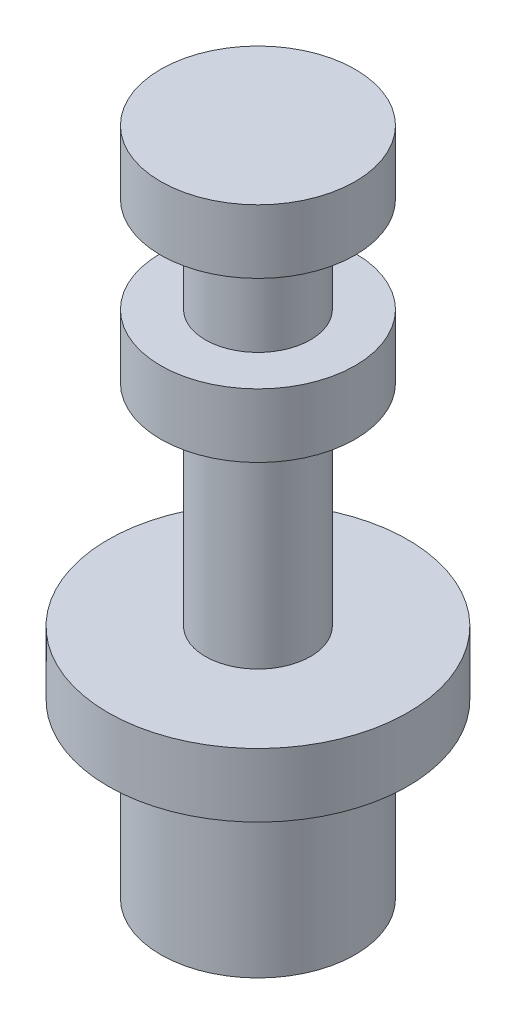
ISO-10303-21;
HEADER;
FILE_DESCRIPTION(('STEP AP214'),'2;1');
FILE_NAME('part.step','',(''),(''),'','','');
FILE_SCHEMA(('AUTOMOTIVE_DESIGN { 1 0 10303 214 1 1 1 1 }'));
ENDSEC;
DATA;
#1=APPLICATION_CONTEXT('core data for automotive mechanical design processes');
#2=APPLICATION_PROTOCOL_DEFINITION('international standard','automotive_design',2000,#1);
#3=PRODUCT_CONTEXT('',#1,'mechanical');
#4=PRODUCT('Part','Part','',(#3));
#5=PRODUCT_RELATED_PRODUCT_CATEGORY('part','',(#4));
#6=PRODUCT_DEFINITION_FORMATION('','',#4);
#7=PRODUCT_DEFINITION_CONTEXT('part definition',#1,'design');
#8=PRODUCT_DEFINITION('design','',#6,#7);
#9=PRODUCT_DEFINITION_SHAPE('','',#8);
#10=(LENGTH_UNIT() NAMED_UNIT(*) SI_UNIT(.MILLI.,.METRE.));
#11=(NAMED_UNIT(*) PLANE_ANGLE_UNIT() SI_UNIT($,.RADIAN.));
#12=(NAMED_UNIT(*) SI_UNIT($,.STERADIAN.) SOLID_ANGLE_UNIT());
#13=UNCERTAINTY_MEASURE_WITH_UNIT(LENGTH_MEASURE(1.E-05),#10,'distance_accuracy_value','');
#14=(GEOMETRIC_REPRESENTATION_CONTEXT(3) GLOBAL_UNCERTAINTY_ASSIGNED_CONTEXT((#13)) GLOBAL_UNIT_ASSIGNED_CONTEXT((#10,
#11,#12)) REPRESENTATION_CONTEXT('',''));
#15=CARTESIAN_POINT('',(0.,0.,0.));
#16=DIRECTION('',(0.,0.,1.));
#17=DIRECTION('',(1.,0.,0.));
#18=AXIS2_PLACEMENT_3D('',#15,#16,#17);
#19=CARTESIAN_POINT('',(0.,1.3716,0.));
#20=DIRECTION('',(0.,-1.,0.));
#21=DIRECTION('',(0.,0.,-1.));
#22=AXIS2_PLACEMENT_3D('',#19,#20,#21);
#23=CYLINDRICAL_SURFACE('',#22,0.7747);
#24=CARTESIAN_POINT('',(0.,1.3716,0.));
#25=DIRECTION('',(0.,1.,0.));
#26=DIRECTION('',(0.,0.,1.));
#27=AXIS2_PLACEMENT_3D('',#24,#25,#26);
#28=CIRCLE('',#27,0.7747);
#29=CARTESIAN_POINT('',(0.,1.3716,0.7747));
#30=VERTEX_POINT('',#29);
#31=EDGE_CURVE('E51',#30,#30,#28,.T.);
#32=ORIENTED_EDGE('',*,*,#31,.F.);
#33=EDGE_LOOP('',(#32));
#34=FACE_BOUND('',#33,.T.);
#35=CARTESIAN_POINT('',(0.,0.,0.));
#36=DIRECTION('',(0.,1.,0.));
#37=DIRECTION('',(0.,0.,1.));
#38=AXIS2_PLACEMENT_3D('',#35,#36,#37);
#39=CIRCLE('',#38,0.7747);
#40=CARTESIAN_POINT('',(0.,0.,0.7747));
#41=VERTEX_POINT('',#40);
#42=EDGE_CURVE('E42',#41,#41,#39,.T.);
#43=ORIENTED_EDGE('',*,*,#42,.T.);
#44=EDGE_LOOP('',(#43));
#45=FACE_BOUND('',#44,.T.);
#46=ADVANCED_FACE('F39',(#34,#45),#23,.T.);
#47=CARTESIAN_POINT('',(0.,0.,0.));
#48=DIRECTION('',(0.,1.,0.));
#49=DIRECTION('',(0.,0.,1.));
#50=AXIS2_PLACEMENT_3D('',#47,#48,#49);
#51=PLANE('',#50);
#52=ORIENTED_EDGE('',*,*,#42,.F.);
#53=EDGE_LOOP('',(#52));
#54=FACE_BOUND('',#53,.T.);
#55=ADVANCED_FACE('F78',(#54),#51,.F.);
#56=CARTESIAN_POINT('',(0.,1.8796,0.));
#57=DIRECTION('',(0.,-1.,0.));
#58=DIRECTION('',(0.,0.,-1.));
#59=AXIS2_PLACEMENT_3D('',#56,#57,#58);
#60=CYLINDRICAL_SURFACE('',#59,1.1938);
#61=CARTESIAN_POINT('',(0.,1.8796,0.));
#62=DIRECTION('',(0.,1.,0.));
#63=DIRECTION('',(0.,0.,1.));
#64=AXIS2_PLACEMENT_3D('',#61,#62,#63);
#65=CIRCLE('',#64,1.1938);
#66=CARTESIAN_POINT('',(0.,1.8796,1.1938));
#67=VERTEX_POINT('',#66);
#68=EDGE_CURVE('E67',#67,#67,#65,.T.);
#69=ORIENTED_EDGE('',*,*,#68,.F.);
#70=EDGE_LOOP('',(#69));
#71=FACE_BOUND('',#70,.T.);
#72=CARTESIAN_POINT('',(0.,1.3716,0.));
#73=DIRECTION('',(0.,1.,0.));
#74=DIRECTION('',(0.,0.,1.));
#75=AXIS2_PLACEMENT_3D('',#72,#73,#74);
#76=CIRCLE('',#75,1.1938);
#77=CARTESIAN_POINT('',(0.,1.3716,1.1938));
#78=VERTEX_POINT('',#77);
#79=EDGE_CURVE('E65',#78,#78,#76,.T.);
#80=ORIENTED_EDGE('',*,*,#79,.T.);
#81=EDGE_LOOP('',(#80));
#82=FACE_BOUND('',#81,.T.);
#83=ADVANCED_FACE('F80',(#71,#82),#60,.T.);
#84=CARTESIAN_POINT('',(0.,1.8796,0.));
#85=DIRECTION('',(0.,1.,0.));
#86=DIRECTION('',(0.,0.,1.));
#87=AXIS2_PLACEMENT_3D('',#84,#85,#86);
#88=PLANE('',#87);
#89=CARTESIAN_POINT('',(0.,1.8796,0.));
#90=DIRECTION('',(0.,1.,0.));
#91=DIRECTION('',(0.,0.,1.));
#92=AXIS2_PLACEMENT_3D('',#89,#90,#91);
#93=CIRCLE('',#92,0.4191);
#94=CARTESIAN_POINT('',(0.,1.8796,0.4191));
#95=VERTEX_POINT('',#94);
#96=EDGE_CURVE('E46',#95,#95,#93,.T.);
#97=ORIENTED_EDGE('',*,*,#96,.F.);
#98=EDGE_LOOP('',(#97));
#99=FACE_BOUND('',#98,.T.);
#100=ORIENTED_EDGE('',*,*,#68,.T.);
#101=EDGE_LOOP('',(#100));
#102=FACE_BOUND('',#101,.T.);
#103=ADVANCED_FACE('F85',(#99,#102),#88,.T.);
#104=CARTESIAN_POINT('',(0.,1.3716,0.));
#105=DIRECTION('',(0.,1.,0.));
#106=DIRECTION('',(0.,0.,1.));
#107=AXIS2_PLACEMENT_3D('',#104,#105,#106);
#108=PLANE('',#107);
#109=ORIENTED_EDGE('',*,*,#31,.T.);
#110=EDGE_LOOP('',(#109));
#111=FACE_BOUND('',#110,.T.);
#112=ORIENTED_EDGE('',*,*,#79,.F.);
#113=EDGE_LOOP('',(#112));
#114=FACE_BOUND('',#113,.T.);
#115=ADVANCED_FACE('F90',(#111,#114),#108,.F.);
#116=CARTESIAN_POINT('',(0.,3.556,0.));
#117=DIRECTION('',(0.,-1.,0.));
#118=DIRECTION('',(0.,0.,-1.));
#119=AXIS2_PLACEMENT_3D('',#116,#117,#118);
#120=CYLINDRICAL_SURFACE('',#119,0.4191);
#121=CARTESIAN_POINT('',(0.,3.556,0.));
#122=DIRECTION('',(0.,1.,0.));
#123=DIRECTION('',(0.,0.,1.));
#124=AXIS2_PLACEMENT_3D('',#121,#122,#123);
#125=CIRCLE('',#124,0.4191);
#126=CARTESIAN_POINT('',(0.,3.556,0.4191));
#127=VERTEX_POINT('',#126);
#128=EDGE_CURVE('E60',#127,#127,#125,.T.);
#129=ORIENTED_EDGE('',*,*,#128,.F.);
#130=EDGE_LOOP('',(#129));
#131=FACE_BOUND('',#130,.T.);
#132=ORIENTED_EDGE('',*,*,#96,.T.);
#133=EDGE_LOOP('',(#132));
#134=FACE_BOUND('',#133,.T.);
#135=ADVANCED_FACE('F93',(#131,#134),#120,.T.);
#136=CARTESIAN_POINT('',(0.,4.064,0.));
#137=DIRECTION('',(0.,-1.,0.));
#138=DIRECTION('',(0.,0.,-1.));
#139=AXIS2_PLACEMENT_3D('',#136,#137,#138);
#140=CYLINDRICAL_SURFACE('',#139,0.7747);
#141=CARTESIAN_POINT('',(0.,4.064,0.));
#142=DIRECTION('',(0.,1.,0.));
#143=DIRECTION('',(0.,0.,1.));
#144=AXIS2_PLACEMENT_3D('',#141,#142,#143);
#145=CIRCLE('',#144,0.7747);
#146=CARTESIAN_POINT('',(0.,4.064,0.7747));
#147=VERTEX_POINT('',#146);
#148=EDGE_CURVE('E57',#147,#147,#145,.T.);
#149=ORIENTED_EDGE('',*,*,#148,.F.);
#150=EDGE_LOOP('',(#149));
#151=FACE_BOUND('',#150,.T.);
#152=CARTESIAN_POINT('',(0.,3.556,0.));
#153=DIRECTION('',(0.,1.,0.));
#154=DIRECTION('',(0.,0.,1.));
#155=AXIS2_PLACEMENT_3D('',#152,#153,#154);
#156=CIRCLE('',#155,0.7747);
#157=CARTESIAN_POINT('',(0.,3.556,0.7747));
#158=VERTEX_POINT('',#157);
#159=EDGE_CURVE('E61',#158,#158,#156,.T.);
#160=ORIENTED_EDGE('',*,*,#159,.T.);
#161=EDGE_LOOP('',(#160));
#162=FACE_BOUND('',#161,.T.);
#163=ADVANCED_FACE('F99',(#151,#162),#140,.T.);
#164=CARTESIAN_POINT('',(0.,4.064,0.));
#165=DIRECTION('',(0.,1.,0.));
#166=DIRECTION('',(0.,0.,1.));
#167=AXIS2_PLACEMENT_3D('',#164,#165,#166);
#168=PLANE('',#167);
#169=CARTESIAN_POINT('',(0.,4.064,0.));
#170=DIRECTION('',(0.,1.,0.));
#171=DIRECTION('',(0.,0.,1.));
#172=AXIS2_PLACEMENT_3D('',#169,#170,#171);
#173=CIRCLE('',#172,0.4191);
#174=CARTESIAN_POINT('',(0.,4.064,0.4191));
#175=VERTEX_POINT('',#174);
#176=EDGE_CURVE('E10',#175,#175,#173,.T.);
#177=ORIENTED_EDGE('',*,*,#176,.F.);
#178=EDGE_LOOP('',(#177));
#179=FACE_BOUND('',#178,.T.);
#180=ORIENTED_EDGE('',*,*,#148,.T.);
#181=EDGE_LOOP('',(#180));
#182=FACE_BOUND('',#181,.T.);
#183=ADVANCED_FACE('F103',(#179,#182),#168,.T.);
#184=CARTESIAN_POINT('',(0.,3.556,0.));
#185=DIRECTION('',(0.,1.,0.));
#186=DIRECTION('',(0.,0.,1.));
#187=AXIS2_PLACEMENT_3D('',#184,#185,#186);
#188=PLANE('',#187);
#189=ORIENTED_EDGE('',*,*,#128,.T.);
#190=EDGE_LOOP('',(#189));
#191=FACE_BOUND('',#190,.T.);
#192=ORIENTED_EDGE('',*,*,#159,.F.);
#193=EDGE_LOOP('',(#192));
#194=FACE_BOUND('',#193,.T.);
#195=ADVANCED_FACE('F105',(#191,#194),#188,.F.);
#196=CARTESIAN_POINT('',(0.,4.826,0.));
#197=DIRECTION('',(0.,-1.,0.));
#198=DIRECTION('',(0.,0.,-1.));
#199=AXIS2_PLACEMENT_3D('',#196,#197,#198);
#200=CYLINDRICAL_SURFACE('',#199,0.4191);
#201=CARTESIAN_POINT('',(0.,4.826,0.));
#202=DIRECTION('',(0.,1.,0.));
#203=DIRECTION('',(0.,0.,1.));
#204=AXIS2_PLACEMENT_3D('',#201,#202,#203);
#205=CIRCLE('',#204,0.4191);
#206=CARTESIAN_POINT('',(0.,4.826,0.4191));
#207=VERTEX_POINT('',#206);
#208=EDGE_CURVE('E55',#207,#207,#205,.T.);
#209=ORIENTED_EDGE('',*,*,#208,.F.);
#210=EDGE_LOOP('',(#209));
#211=FACE_BOUND('',#210,.T.);
#212=ORIENTED_EDGE('',*,*,#176,.T.);
#213=EDGE_LOOP('',(#212));
#214=FACE_BOUND('',#213,.T.);
#215=ADVANCED_FACE('F108',(#211,#214),#200,.T.);
#216=CARTESIAN_POINT('',(0.,5.334,0.));
#217=DIRECTION('',(0.,-1.,0.));
#218=DIRECTION('',(0.,0.,-1.));
#219=AXIS2_PLACEMENT_3D('',#216,#217,#218);
#220=CYLINDRICAL_SURFACE('',#219,0.7747);
#221=CARTESIAN_POINT('',(0.,5.334,0.));
#222=DIRECTION('',(0.,1.,0.));
#223=DIRECTION('',(0.,0.,1.));
#224=AXIS2_PLACEMENT_3D('',#221,#222,#223);
#225=CIRCLE('',#224,0.7747);
#226=CARTESIAN_POINT('',(0.,5.334,0.7747));
#227=VERTEX_POINT('',#226);
#228=EDGE_CURVE('E131',#227,#227,#225,.T.);
#229=ORIENTED_EDGE('',*,*,#228,.F.);
#230=EDGE_LOOP('',(#229));
#231=FACE_BOUND('',#230,.T.);
#232=CARTESIAN_POINT('',(0.,4.826,0.));
#233=DIRECTION('',(0.,1.,0.));
#234=DIRECTION('',(0.,0.,1.));
#235=AXIS2_PLACEMENT_3D('',#232,#233,#234);
#236=CIRCLE('',#235,0.7747);
#237=CARTESIAN_POINT('',(0.,4.826,0.7747));
#238=VERTEX_POINT('',#237);
#239=EDGE_CURVE('E132',#238,#238,#236,.T.);
#240=ORIENTED_EDGE('',*,*,#239,.T.);
#241=EDGE_LOOP('',(#240));
#242=FACE_BOUND('',#241,.T.);
#243=ADVANCED_FACE('F115',(#231,#242),#220,.T.);
#244=CARTESIAN_POINT('',(0.,5.334,0.));
#245=DIRECTION('',(0.,1.,0.));
#246=DIRECTION('',(0.,0.,1.));
#247=AXIS2_PLACEMENT_3D('',#244,#245,#246);
#248=PLANE('',#247);
#249=ORIENTED_EDGE('',*,*,#228,.T.);
#250=EDGE_LOOP('',(#249));
#251=FACE_BOUND('',#250,.T.);
#252=ADVANCED_FACE('F119',(#251),#248,.T.);
#253=CARTESIAN_POINT('',(0.,4.826,0.));
#254=DIRECTION('',(0.,1.,0.));
#255=DIRECTION('',(0.,0.,1.));
#256=AXIS2_PLACEMENT_3D('',#253,#254,#255);
#257=PLANE('',#256);
#258=ORIENTED_EDGE('',*,*,#208,.T.);
#259=EDGE_LOOP('',(#258));
#260=FACE_BOUND('',#259,.T.);
#261=ORIENTED_EDGE('',*,*,#239,.F.);
#262=EDGE_LOOP('',(#261));
#263=FACE_BOUND('',#262,.T.);
#264=ADVANCED_FACE('F121',(#260,#263),#257,.F.);
#265=CLOSED_SHELL('',(#46,#55,#83,#103,#115,#135,#163,#183,#195,#215,#243,#252,#264));
#266=MANIFOLD_SOLID_BREP('B2',#265);
#267=ADVANCED_BREP_SHAPE_REPRESENTATION('',(#18,#266),#14);
#268=SHAPE_DEFINITION_REPRESENTATION(#9,#267);
ENDSEC;
END-ISO-10303-21;
